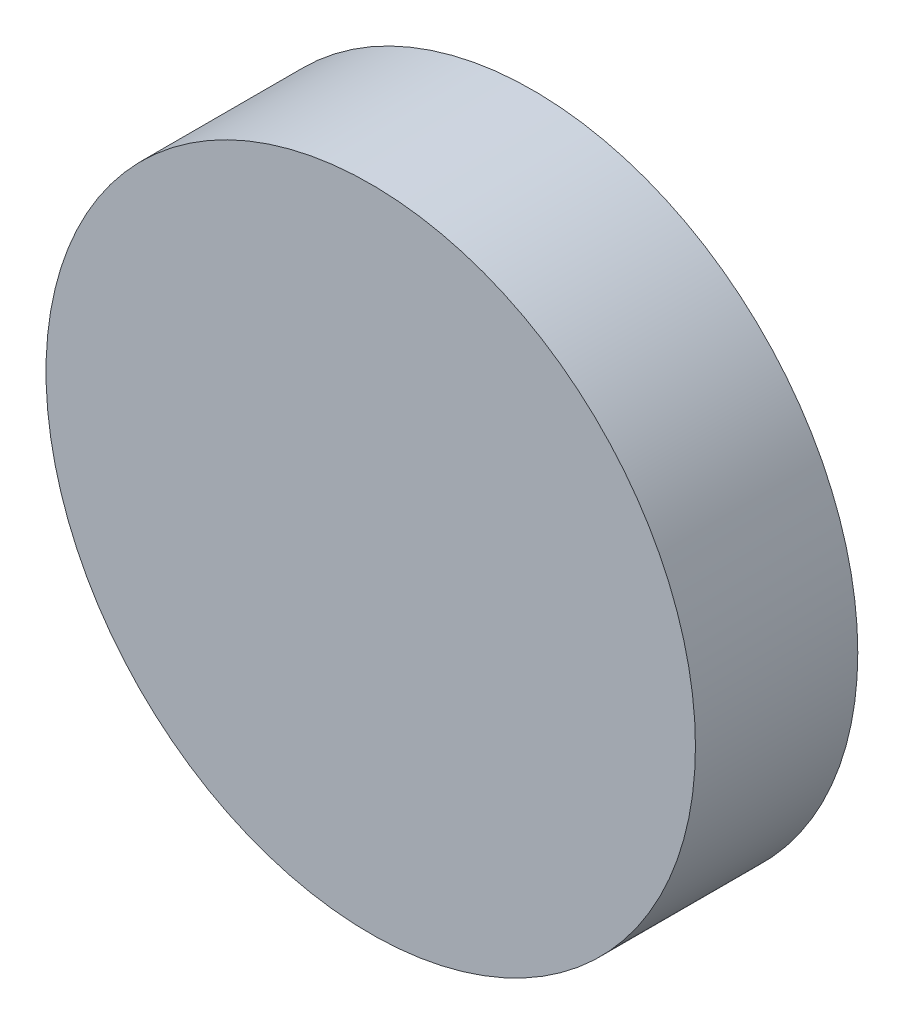
ISO-10303-21;
HEADER;
FILE_DESCRIPTION(('STEP AP214'),'2;1');
FILE_NAME('part.step','',(''),(''),'','','');
FILE_SCHEMA(('AUTOMOTIVE_DESIGN { 1 0 10303 214 1 1 1 1 }'));
ENDSEC;
DATA;
#1=APPLICATION_CONTEXT('core data for automotive mechanical design processes');
#2=APPLICATION_PROTOCOL_DEFINITION('international standard','automotive_design',2000,#1);
#3=PRODUCT_CONTEXT('',#1,'mechanical');
#4=PRODUCT('Part','Part','',(#3));
#5=PRODUCT_RELATED_PRODUCT_CATEGORY('part','',(#4));
#6=PRODUCT_DEFINITION_FORMATION('','',#4);
#7=PRODUCT_DEFINITION_CONTEXT('part definition',#1,'design');
#8=PRODUCT_DEFINITION('design','',#6,#7);
#9=PRODUCT_DEFINITION_SHAPE('','',#8);
#10=(LENGTH_UNIT() NAMED_UNIT(*) SI_UNIT(.MILLI.,.METRE.));
#11=(NAMED_UNIT(*) PLANE_ANGLE_UNIT() SI_UNIT($,.RADIAN.));
#12=(NAMED_UNIT(*) SI_UNIT($,.STERADIAN.) SOLID_ANGLE_UNIT());
#13=UNCERTAINTY_MEASURE_WITH_UNIT(LENGTH_MEASURE(1.E-05),#10,'distance_accuracy_value','');
#14=(GEOMETRIC_REPRESENTATION_CONTEXT(3) GLOBAL_UNCERTAINTY_ASSIGNED_CONTEXT((#13)) GLOBAL_UNIT_ASSIGNED_CONTEXT((#10,
#11,#12)) REPRESENTATION_CONTEXT('',''));
#15=CARTESIAN_POINT('',(0.,0.,0.));
#16=DIRECTION('',(0.,0.,1.));
#17=DIRECTION('',(1.,0.,0.));
#18=AXIS2_PLACEMENT_3D('',#15,#16,#17);
#19=CARTESIAN_POINT('',(0.,0.,1.));
#20=DIRECTION('',(0.,0.,-1.));
#21=DIRECTION('',(-1.,0.,0.));
#22=AXIS2_PLACEMENT_3D('',#19,#20,#21);
#23=CYLINDRICAL_SURFACE('',#22,2.);
#24=CARTESIAN_POINT('',(0.,0.,1.));
#25=DIRECTION('',(0.,0.,1.));
#26=DIRECTION('',(1.,0.,0.));
#27=AXIS2_PLACEMENT_3D('',#24,#25,#26);
#28=CIRCLE('',#27,2.);
#29=CARTESIAN_POINT('',(2.,0.,1.));
#30=VERTEX_POINT('',#29);
#31=EDGE_CURVE('E10',#30,#30,#28,.T.);
#32=ORIENTED_EDGE('',*,*,#31,.F.);
#33=EDGE_LOOP('',(#32));
#34=FACE_BOUND('',#33,.T.);
#35=CARTESIAN_POINT('',(0.,0.,0.));
#36=DIRECTION('',(0.,0.,1.));
#37=DIRECTION('',(1.,0.,0.));
#38=AXIS2_PLACEMENT_3D('',#35,#36,#37);
#39=CIRCLE('',#38,2.);
#40=CARTESIAN_POINT('',(2.,0.,0.));
#41=VERTEX_POINT('',#40);
#42=EDGE_CURVE('E46',#41,#41,#39,.T.);
#43=ORIENTED_EDGE('',*,*,#42,.T.);
#44=EDGE_LOOP('',(#43));
#45=FACE_BOUND('',#44,.T.);
#46=ADVANCED_FACE('F43',(#34,#45),#23,.T.);
#47=CARTESIAN_POINT('',(0.,0.,1.));
#48=DIRECTION('',(0.,0.,1.));
#49=DIRECTION('',(1.,0.,0.));
#50=AXIS2_PLACEMENT_3D('',#47,#48,#49);
#51=PLANE('',#50);
#52=ORIENTED_EDGE('',*,*,#31,.T.);
#53=EDGE_LOOP('',(#52));
#54=FACE_BOUND('',#53,.T.);
#55=ADVANCED_FACE('F60',(#54),#51,.T.);
#56=CARTESIAN_POINT('',(0.,0.,0.));
#57=DIRECTION('',(0.,0.,1.));
#58=DIRECTION('',(1.,0.,0.));
#59=AXIS2_PLACEMENT_3D('',#56,#57,#58);
#60=PLANE('',#59);
#61=ORIENTED_EDGE('',*,*,#42,.F.);
#62=EDGE_LOOP('',(#61));
#63=FACE_BOUND('',#62,.T.);
#64=ADVANCED_FACE('F58',(#63),#60,.F.);
#65=CLOSED_SHELL('',(#46,#55,#64));
#66=MANIFOLD_SOLID_BREP('B2',#65);
#67=ADVANCED_BREP_SHAPE_REPRESENTATION('',(#18,#66),#14);
#68=SHAPE_DEFINITION_REPRESENTATION(#9,#67);
ENDSEC;
END-ISO-10303-21;
